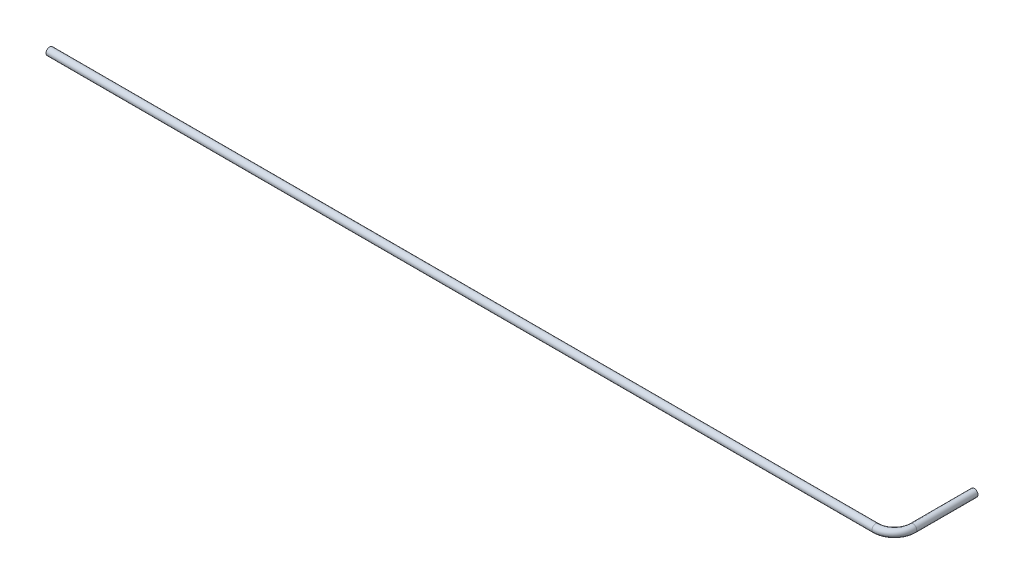
ISO-10303-21;
HEADER;
FILE_DESCRIPTION(('STEP AP214'),'2;1');
FILE_NAME('part.step','',(''),(''),'','','');
FILE_SCHEMA(('AUTOMOTIVE_DESIGN { 1 0 10303 214 1 1 1 1 }'));
ENDSEC;
DATA;
#1=APPLICATION_CONTEXT('core data for automotive mechanical design processes');
#2=APPLICATION_PROTOCOL_DEFINITION('international standard','automotive_design',2000,#1);
#3=PRODUCT_CONTEXT('',#1,'mechanical');
#4=PRODUCT('Part','Part','',(#3));
#5=PRODUCT_RELATED_PRODUCT_CATEGORY('part','',(#4));
#6=PRODUCT_DEFINITION_FORMATION('','',#4);
#7=PRODUCT_DEFINITION_CONTEXT('part definition',#1,'design');
#8=PRODUCT_DEFINITION('design','',#6,#7);
#9=PRODUCT_DEFINITION_SHAPE('','',#8);
#10=(LENGTH_UNIT() NAMED_UNIT(*) SI_UNIT(.MILLI.,.METRE.));
#11=(NAMED_UNIT(*) PLANE_ANGLE_UNIT() SI_UNIT($,.RADIAN.));
#12=(NAMED_UNIT(*) SI_UNIT($,.STERADIAN.) SOLID_ANGLE_UNIT());
#13=UNCERTAINTY_MEASURE_WITH_UNIT(LENGTH_MEASURE(1.E-05),#10,'distance_accuracy_value','');
#14=(GEOMETRIC_REPRESENTATION_CONTEXT(3) GLOBAL_UNCERTAINTY_ASSIGNED_CONTEXT((#13)) GLOBAL_UNIT_ASSIGNED_CONTEXT((#10,
#11,#12)) REPRESENTATION_CONTEXT('',''));
#15=CARTESIAN_POINT('',(0.,0.,0.));
#16=DIRECTION('',(0.,0.,1.));
#17=DIRECTION('',(1.,0.,0.));
#18=AXIS2_PLACEMENT_3D('',#15,#16,#17);
#19=CARTESIAN_POINT('',(-2.54000000000002,0.,0.));
#20=DIRECTION('',(-1.,0.,0.));
#21=DIRECTION('',(0.,0.,1.));
#22=AXIS2_PLACEMENT_3D('',#19,#20,#21);
#23=CYLINDRICAL_SURFACE('',#22,0.5);
#24=CARTESIAN_POINT('',(-2.54000000000002,0.,0.));
#25=DIRECTION('',(-1.,0.,0.));
#26=DIRECTION('',(0.,0.,1.));
#27=AXIS2_PLACEMENT_3D('',#24,#25,#26);
#28=CIRCLE('',#27,0.5);
#29=CARTESIAN_POINT('',(-2.54000000000002,0.,0.5));
#30=VERTEX_POINT('',#29);
#31=EDGE_CURVE('E45',#30,#30,#28,.T.);
#32=ORIENTED_EDGE('',*,*,#31,.T.);
#33=EDGE_LOOP('',(#32));
#34=FACE_BOUND('',#33,.T.);
#35=CARTESIAN_POINT('',(-114.742555238075,0.,0.));
#36=DIRECTION('',(-1.,0.,0.));
#37=DIRECTION('',(0.,0.,1.));
#38=AXIS2_PLACEMENT_3D('',#35,#36,#37);
#39=CIRCLE('',#38,0.5);
#40=CARTESIAN_POINT('',(-114.742555238075,0.,0.5));
#41=VERTEX_POINT('',#40);
#42=EDGE_CURVE('E10',#41,#41,#39,.T.);
#43=ORIENTED_EDGE('',*,*,#42,.F.);
#44=EDGE_LOOP('',(#43));
#45=FACE_BOUND('',#44,.T.);
#46=ADVANCED_FACE('F38',(#34,#45),#23,.T.);
#47=CARTESIAN_POINT('',(-2.54,0.,-2.54));
#48=DIRECTION('',(0.,-1.,0.));
#49=DIRECTION('',(0.,0.,-1.));
#50=AXIS2_PLACEMENT_3D('',#47,#48,#49);
#51=TOROIDAL_SURFACE('',#50,2.54,0.5);
#52=CARTESIAN_POINT('',(0.,0.,-2.54000000000002));
#53=DIRECTION('',(0.,0.,1.));
#54=DIRECTION('',(1.,0.,0.));
#55=AXIS2_PLACEMENT_3D('',#52,#53,#54);
#56=CIRCLE('',#55,0.5);
#57=CARTESIAN_POINT('',(0.5,0.,-2.54000000000002));
#58=VERTEX_POINT('',#57);
#59=EDGE_CURVE('E50',#58,#58,#56,.T.);
#60=CARTESIAN_POINT('',(-2.54,0.,-2.54));
#61=DIRECTION('',(0.,-1.,0.));
#62=DIRECTION('',(0.,0.,-1.));
#63=AXIS2_PLACEMENT_3D('',#60,#61,#62);
#64=CIRCLE('',#63,3.04);
#65=EDGE_CURVE('',#58,#30,#64,.T.);
#66=ORIENTED_EDGE('',*,*,#59,.T.);
#67=ORIENTED_EDGE('',*,*,#31,.F.);
#68=ORIENTED_EDGE('',*,*,#65,.T.);
#69=ORIENTED_EDGE('',*,*,#65,.F.);
#70=EDGE_LOOP('',(#66,#68,#67,#69));
#71=FACE_BOUND('',#70,.T.);
#72=ADVANCED_FACE('F74',(#71),#51,.T.);
#73=CARTESIAN_POINT('',(0.,0.,-2.54000000000002));
#74=DIRECTION('',(0.,0.,-1.));
#75=DIRECTION('',(-1.,0.,0.));
#76=AXIS2_PLACEMENT_3D('',#73,#74,#75);
#77=CYLINDRICAL_SURFACE('',#76,0.5);
#78=ORIENTED_EDGE('',*,*,#59,.F.);
#79=EDGE_LOOP('',(#78));
#80=FACE_BOUND('',#79,.T.);
#81=CARTESIAN_POINT('',(0.,0.,-10.857648334444));
#82=DIRECTION('',(0.,0.,1.));
#83=DIRECTION('',(1.,0.,0.));
#84=AXIS2_PLACEMENT_3D('',#81,#82,#83);
#85=CIRCLE('',#84,0.5);
#86=CARTESIAN_POINT('',(0.5,0.,-10.857648334444));
#87=VERTEX_POINT('',#86);
#88=EDGE_CURVE('E55',#87,#87,#85,.T.);
#89=ORIENTED_EDGE('',*,*,#88,.T.);
#90=EDGE_LOOP('',(#89));
#91=FACE_BOUND('',#90,.T.);
#92=ADVANCED_FACE('F62',(#80,#91),#77,.T.);
#93=CARTESIAN_POINT('',(-114.742555238075,0.,0.));
#94=DIRECTION('',(-1.,0.,0.));
#95=DIRECTION('',(0.,0.,1.));
#96=AXIS2_PLACEMENT_3D('',#93,#94,#95);
#97=PLANE('',#96);
#98=ORIENTED_EDGE('',*,*,#42,.T.);
#99=EDGE_LOOP('',(#98));
#100=FACE_BOUND('',#99,.T.);
#101=ADVANCED_FACE('F66',(#100),#97,.T.);
#102=CARTESIAN_POINT('',(0.,0.,-10.857648334444));
#103=DIRECTION('',(0.,0.,1.));
#104=DIRECTION('',(1.,0.,0.));
#105=AXIS2_PLACEMENT_3D('',#102,#103,#104);
#106=PLANE('',#105);
#107=ORIENTED_EDGE('',*,*,#88,.F.);
#108=EDGE_LOOP('',(#107));
#109=FACE_BOUND('',#108,.T.);
#110=ADVANCED_FACE('F64',(#109),#106,.F.);
#111=CLOSED_SHELL('',(#46,#72,#92,#101,#110));
#112=MANIFOLD_SOLID_BREP('B2',#111);
#113=ADVANCED_BREP_SHAPE_REPRESENTATION('',(#18,#112),#14);
#114=SHAPE_DEFINITION_REPRESENTATION(#9,#113);
ENDSEC;
END-ISO-10303-21;
